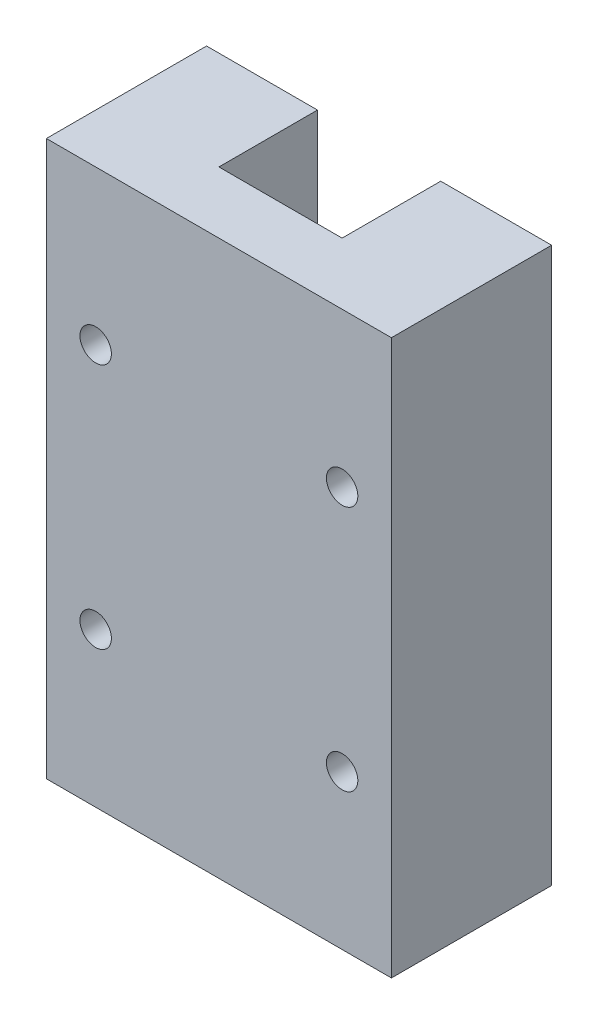
ISO-10303-21;
HEADER;
FILE_DESCRIPTION(('STEP AP214'),'2;1');
FILE_NAME('part.step','',(''),(''),'','','');
FILE_SCHEMA(('AUTOMOTIVE_DESIGN { 1 0 10303 214 1 1 1 1 }'));
ENDSEC;
DATA;
#1=APPLICATION_CONTEXT('core data for automotive mechanical design processes');
#2=APPLICATION_PROTOCOL_DEFINITION('international standard','automotive_design',2000,#1);
#3=PRODUCT_CONTEXT('',#1,'mechanical');
#4=PRODUCT('Part','Part','',(#3));
#5=PRODUCT_RELATED_PRODUCT_CATEGORY('part','',(#4));
#6=PRODUCT_DEFINITION_FORMATION('','',#4);
#7=PRODUCT_DEFINITION_CONTEXT('part definition',#1,'design');
#8=PRODUCT_DEFINITION('design','',#6,#7);
#9=PRODUCT_DEFINITION_SHAPE('','',#8);
#10=(LENGTH_UNIT() NAMED_UNIT(*) SI_UNIT(.MILLI.,.METRE.));
#11=(NAMED_UNIT(*) PLANE_ANGLE_UNIT() SI_UNIT($,.RADIAN.));
#12=(NAMED_UNIT(*) SI_UNIT($,.STERADIAN.) SOLID_ANGLE_UNIT());
#13=UNCERTAINTY_MEASURE_WITH_UNIT(LENGTH_MEASURE(1.E-05),#10,'distance_accuracy_value','');
#14=(GEOMETRIC_REPRESENTATION_CONTEXT(3) GLOBAL_UNCERTAINTY_ASSIGNED_CONTEXT((#13)) GLOBAL_UNIT_ASSIGNED_CONTEXT((#10,
#11,#12)) REPRESENTATION_CONTEXT('',''));
#15=CARTESIAN_POINT('',(0.,0.,0.));
#16=DIRECTION('',(0.,0.,1.));
#17=DIRECTION('',(1.,0.,0.));
#18=AXIS2_PLACEMENT_3D('',#15,#16,#17);
#19=CARTESIAN_POINT('',(0.,45.,-13.));
#20=DIRECTION('',(0.,0.,-1.));
#21=DIRECTION('',(-1.,0.,0.));
#22=AXIS2_PLACEMENT_3D('',#19,#20,#21);
#23=PLANE('',#22);
#24=CARTESIAN_POINT('',(10.,12.5,-13.));
#25=DIRECTION('',(0.,0.,-1.));
#26=DIRECTION('',(-1.,0.,0.));
#27=AXIS2_PLACEMENT_3D('',#24,#25,#26);
#28=CIRCLE('',#27,1.27410282823625);
#29=CARTESIAN_POINT('',(8.72589717176375,12.5,-13.));
#30=VERTEX_POINT('',#29);
#31=EDGE_CURVE('E185',#30,#30,#28,.F.);
#32=ORIENTED_EDGE('',*,*,#31,.T.);
#33=EDGE_LOOP('',(#32));
#34=FACE_BOUND('',#33,.T.);
#35=CARTESIAN_POINT('',(10.,32.5,-13.));
#36=DIRECTION('',(0.,0.,-1.));
#37=DIRECTION('',(-1.,0.,0.));
#38=AXIS2_PLACEMENT_3D('',#35,#36,#37);
#39=CIRCLE('',#38,1.27410282823625);
#40=CARTESIAN_POINT('',(8.72589717176375,32.5,-13.));
#41=VERTEX_POINT('',#40);
#42=EDGE_CURVE('E179',#41,#41,#39,.F.);
#43=ORIENTED_EDGE('',*,*,#42,.T.);
#44=EDGE_LOOP('',(#43));
#45=FACE_BOUND('',#44,.T.);
#46=DIRECTION('',(1.,0.,0.));
#47=VECTOR('',#46,1.);
#48=CARTESIAN_POINT('',(0.,0.,-13.));
#49=LINE('',#48,#47);
#50=CARTESIAN_POINT('',(5.00000000000001,0.,-13.));
#51=VERTEX_POINT('',#50);
#52=CARTESIAN_POINT('',(14.,0.,-13.));
#53=VERTEX_POINT('',#52);
#54=EDGE_CURVE('E130',#51,#53,#49,.T.);
#55=ORIENTED_EDGE('',*,*,#54,.F.);
#56=DIRECTION('',(0.,-1.,0.));
#57=VECTOR('',#56,1.);
#58=CARTESIAN_POINT('',(5.00000000000001,45.,-13.));
#59=LINE('',#58,#57);
#60=CARTESIAN_POINT('',(5.00000000000001,45.,-13.));
#61=VERTEX_POINT('',#60);
#62=EDGE_CURVE('E11',#61,#51,#59,.T.);
#63=ORIENTED_EDGE('',*,*,#62,.F.);
#64=DIRECTION('',(1.,0.,0.));
#65=VECTOR('',#64,1.);
#66=CARTESIAN_POINT('',(0.,45.,-13.));
#67=LINE('',#66,#65);
#68=CARTESIAN_POINT('',(14.,45.,-13.));
#69=VERTEX_POINT('',#68);
#70=EDGE_CURVE('E149',#61,#69,#67,.T.);
#71=ORIENTED_EDGE('',*,*,#70,.T.);
#72=DIRECTION('',(0.,-1.,0.));
#73=VECTOR('',#72,1.);
#74=CARTESIAN_POINT('',(14.,45.,-13.));
#75=LINE('',#74,#73);
#76=EDGE_CURVE('E52',#69,#53,#75,.T.);
#77=ORIENTED_EDGE('',*,*,#76,.T.);
#78=EDGE_LOOP('',(#55,#63,#71,#77));
#79=FACE_BOUND('',#78,.T.);
#80=ADVANCED_FACE('F35',(#34,#45,#79),#23,.T.);
#81=CARTESIAN_POINT('',(5.00000000000001,45.,0.));
#82=DIRECTION('',(1.,0.,0.));
#83=DIRECTION('',(0.,0.,-1.));
#84=AXIS2_PLACEMENT_3D('',#81,#82,#83);
#85=PLANE('',#84);
#86=DIRECTION('',(0.,0.,1.));
#87=VECTOR('',#86,1.);
#88=CARTESIAN_POINT('',(5.00000000000001,0.,0.));
#89=LINE('',#88,#87);
#90=CARTESIAN_POINT('',(5.00000000000001,0.,-5.));
#91=VERTEX_POINT('',#90);
#92=EDGE_CURVE('E132',#51,#91,#89,.T.);
#93=ORIENTED_EDGE('',*,*,#92,.T.);
#94=DIRECTION('',(0.,-1.,0.));
#95=VECTOR('',#94,1.);
#96=CARTESIAN_POINT('',(5.00000000000001,45.,-5.));
#97=LINE('',#96,#95);
#98=CARTESIAN_POINT('',(5.00000000000001,45.,-5.));
#99=VERTEX_POINT('',#98);
#100=EDGE_CURVE('E44',#99,#91,#97,.T.);
#101=ORIENTED_EDGE('',*,*,#100,.F.);
#102=DIRECTION('',(0.,0.,1.));
#103=VECTOR('',#102,1.);
#104=CARTESIAN_POINT('',(5.00000000000001,45.,0.));
#105=LINE('',#104,#103);
#106=EDGE_CURVE('E174',#61,#99,#105,.T.);
#107=ORIENTED_EDGE('',*,*,#106,.F.);
#108=ORIENTED_EDGE('',*,*,#62,.T.);
#109=EDGE_LOOP('',(#93,#101,#107,#108));
#110=FACE_BOUND('',#109,.T.);
#111=ADVANCED_FACE('F37',(#110),#85,.F.);
#112=CARTESIAN_POINT('',(0.,45.,-5.));
#113=DIRECTION('',(0.,0.,-1.));
#114=DIRECTION('',(-1.,0.,0.));
#115=AXIS2_PLACEMENT_3D('',#112,#113,#114);
#116=PLANE('',#115);
#117=DIRECTION('',(1.,0.,0.));
#118=VECTOR('',#117,1.);
#119=CARTESIAN_POINT('',(0.,0.,-5.));
#120=LINE('',#119,#118);
#121=CARTESIAN_POINT('',(-4.99999999999999,0.,-5.));
#122=VERTEX_POINT('',#121);
#123=EDGE_CURVE('E137',#122,#91,#120,.T.);
#124=ORIENTED_EDGE('',*,*,#123,.F.);
#125=DIRECTION('',(0.,-1.,0.));
#126=VECTOR('',#125,1.);
#127=CARTESIAN_POINT('',(-4.99999999999999,45.,-5.));
#128=LINE('',#127,#126);
#129=CARTESIAN_POINT('',(-4.99999999999999,45.,-5.));
#130=VERTEX_POINT('',#129);
#131=EDGE_CURVE('E155',#130,#122,#128,.T.);
#132=ORIENTED_EDGE('',*,*,#131,.F.);
#133=DIRECTION('',(1.,0.,0.));
#134=VECTOR('',#133,1.);
#135=CARTESIAN_POINT('',(0.,45.,-5.));
#136=LINE('',#135,#134);
#137=EDGE_CURVE('E162',#130,#99,#136,.T.);
#138=ORIENTED_EDGE('',*,*,#137,.T.);
#139=ORIENTED_EDGE('',*,*,#100,.T.);
#140=EDGE_LOOP('',(#124,#132,#138,#139));
#141=FACE_BOUND('',#140,.T.);
#142=ADVANCED_FACE('F160',(#141),#116,.T.);
#143=CARTESIAN_POINT('',(-4.99999999999999,45.,0.));
#144=DIRECTION('',(1.,0.,0.));
#145=DIRECTION('',(0.,0.,-1.));
#146=AXIS2_PLACEMENT_3D('',#143,#144,#145);
#147=PLANE('',#146);
#148=DIRECTION('',(0.,0.,1.));
#149=VECTOR('',#148,1.);
#150=CARTESIAN_POINT('',(-4.99999999999999,0.,0.));
#151=LINE('',#150,#149);
#152=CARTESIAN_POINT('',(-4.99999999999999,0.,-13.));
#153=VERTEX_POINT('',#152);
#154=EDGE_CURVE('E140',#153,#122,#151,.T.);
#155=ORIENTED_EDGE('',*,*,#154,.F.);
#156=DIRECTION('',(0.,-1.,0.));
#157=VECTOR('',#156,1.);
#158=CARTESIAN_POINT('',(-4.99999999999999,45.,-13.));
#159=LINE('',#158,#157);
#160=CARTESIAN_POINT('',(-4.99999999999999,45.,-13.));
#161=VERTEX_POINT('',#160);
#162=EDGE_CURVE('E153',#161,#153,#159,.T.);
#163=ORIENTED_EDGE('',*,*,#162,.F.);
#164=DIRECTION('',(0.,0.,1.));
#165=VECTOR('',#164,1.);
#166=CARTESIAN_POINT('',(-4.99999999999999,45.,0.));
#167=LINE('',#166,#165);
#168=EDGE_CURVE('E173',#161,#130,#167,.T.);
#169=ORIENTED_EDGE('',*,*,#168,.T.);
#170=ORIENTED_EDGE('',*,*,#131,.T.);
#171=EDGE_LOOP('',(#155,#163,#169,#170));
#172=FACE_BOUND('',#171,.T.);
#173=ADVANCED_FACE('F171',(#172),#147,.T.);
#174=CARTESIAN_POINT('',(-10.,32.5,-13.));
#175=DIRECTION('',(0.,0.,-1.));
#176=DIRECTION('',(-1.,0.,0.));
#177=AXIS2_PLACEMENT_3D('',#174,#175,#176);
#178=CIRCLE('',#177,1.27410282823625);
#179=CARTESIAN_POINT('',(-11.2741028282363,32.5,-13.));
#180=VERTEX_POINT('',#179);
#181=EDGE_CURVE('E192',#180,#180,#178,.F.);
#182=ORIENTED_EDGE('',*,*,#181,.T.);
#183=EDGE_LOOP('',(#182));
#184=FACE_BOUND('',#183,.T.);
#185=CARTESIAN_POINT('',(-10.,12.5,-13.));
#186=DIRECTION('',(0.,0.,-1.));
#187=DIRECTION('',(-1.,0.,0.));
#188=AXIS2_PLACEMENT_3D('',#185,#186,#187);
#189=CIRCLE('',#188,1.27410282823625);
#190=CARTESIAN_POINT('',(-11.2741028282363,12.5,-13.));
#191=VERTEX_POINT('',#190);
#192=EDGE_CURVE('E197',#191,#191,#189,.F.);
#193=ORIENTED_EDGE('',*,*,#192,.T.);
#194=EDGE_LOOP('',(#193));
#195=FACE_BOUND('',#194,.T.);
#196=CARTESIAN_POINT('',(-14.,0.,-13.));
#197=VERTEX_POINT('',#196);
#198=EDGE_CURVE('E134',#197,#153,#49,.T.);
#199=ORIENTED_EDGE('',*,*,#198,.F.);
#200=DIRECTION('',(0.,-1.,0.));
#201=VECTOR('',#200,1.);
#202=CARTESIAN_POINT('',(-14.,45.,-13.));
#203=LINE('',#202,#201);
#204=CARTESIAN_POINT('',(-14.,45.,-13.));
#205=VERTEX_POINT('',#204);
#206=EDGE_CURVE('E122',#205,#197,#203,.T.);
#207=ORIENTED_EDGE('',*,*,#206,.F.);
#208=EDGE_CURVE('E112',#205,#161,#67,.T.);
#209=ORIENTED_EDGE('',*,*,#208,.T.);
#210=ORIENTED_EDGE('',*,*,#162,.T.);
#211=EDGE_LOOP('',(#199,#207,#209,#210));
#212=FACE_BOUND('',#211,.T.);
#213=ADVANCED_FACE('F230',(#184,#195,#212),#23,.T.);
#214=CARTESIAN_POINT('',(-14.,45.,0.));
#215=DIRECTION('',(1.,0.,0.));
#216=DIRECTION('',(0.,0.,-1.));
#217=AXIS2_PLACEMENT_3D('',#214,#215,#216);
#218=PLANE('',#217);
#219=DIRECTION('',(0.,0.,1.));
#220=VECTOR('',#219,1.);
#221=CARTESIAN_POINT('',(-14.,0.,0.));
#222=LINE('',#221,#220);
#223=CARTESIAN_POINT('',(-14.,0.,0.));
#224=VERTEX_POINT('',#223);
#225=EDGE_CURVE('E119',#197,#224,#222,.T.);
#226=ORIENTED_EDGE('',*,*,#225,.T.);
#227=DIRECTION('',(0.,-1.,0.));
#228=VECTOR('',#227,1.);
#229=CARTESIAN_POINT('',(-14.,45.,0.));
#230=LINE('',#229,#228);
#231=CARTESIAN_POINT('',(-14.,45.,0.));
#232=VERTEX_POINT('',#231);
#233=EDGE_CURVE('E116',#232,#224,#230,.T.);
#234=ORIENTED_EDGE('',*,*,#233,.F.);
#235=DIRECTION('',(0.,0.,1.));
#236=VECTOR('',#235,1.);
#237=CARTESIAN_POINT('',(-14.,45.,0.));
#238=LINE('',#237,#236);
#239=EDGE_CURVE('E103',#205,#232,#238,.T.);
#240=ORIENTED_EDGE('',*,*,#239,.F.);
#241=ORIENTED_EDGE('',*,*,#206,.T.);
#242=EDGE_LOOP('',(#226,#234,#240,#241));
#243=FACE_BOUND('',#242,.T.);
#244=ADVANCED_FACE('F117',(#243),#218,.F.);
#245=CARTESIAN_POINT('',(0.,45.,0.));
#246=DIRECTION('',(0.,0.,-1.));
#247=DIRECTION('',(-1.,0.,0.));
#248=AXIS2_PLACEMENT_3D('',#245,#246,#247);
#249=PLANE('',#248);
#250=CARTESIAN_POINT('',(-10.,32.5,0.));
#251=DIRECTION('',(0.,0.,1.));
#252=DIRECTION('',(1.,0.,0.));
#253=AXIS2_PLACEMENT_3D('',#250,#251,#252);
#254=CIRCLE('',#253,1.27410282823625);
#255=CARTESIAN_POINT('',(-8.72589717176375,32.5,0.));
#256=VERTEX_POINT('',#255);
#257=EDGE_CURVE('E182',#256,#256,#254,.T.);
#258=ORIENTED_EDGE('',*,*,#257,.F.);
#259=EDGE_LOOP('',(#258));
#260=FACE_BOUND('',#259,.T.);
#261=CARTESIAN_POINT('',(10.,12.5,0.));
#262=DIRECTION('',(0.,0.,1.));
#263=DIRECTION('',(1.,0.,0.));
#264=AXIS2_PLACEMENT_3D('',#261,#262,#263);
#265=CIRCLE('',#264,1.27410282823625);
#266=CARTESIAN_POINT('',(11.2741028282363,12.5,0.));
#267=VERTEX_POINT('',#266);
#268=EDGE_CURVE('E188',#267,#267,#265,.T.);
#269=ORIENTED_EDGE('',*,*,#268,.F.);
#270=EDGE_LOOP('',(#269));
#271=FACE_BOUND('',#270,.T.);
#272=CARTESIAN_POINT('',(-10.,12.5,0.));
#273=DIRECTION('',(0.,0.,1.));
#274=DIRECTION('',(1.,0.,0.));
#275=AXIS2_PLACEMENT_3D('',#272,#273,#274);
#276=CIRCLE('',#275,1.27410282823625);
#277=CARTESIAN_POINT('',(-8.72589717176375,12.5,0.));
#278=VERTEX_POINT('',#277);
#279=EDGE_CURVE('E189',#278,#278,#276,.T.);
#280=ORIENTED_EDGE('',*,*,#279,.F.);
#281=EDGE_LOOP('',(#280));
#282=FACE_BOUND('',#281,.T.);
#283=CARTESIAN_POINT('',(10.,32.5,0.));
#284=DIRECTION('',(0.,0.,1.));
#285=DIRECTION('',(1.,0.,0.));
#286=AXIS2_PLACEMENT_3D('',#283,#284,#285);
#287=CIRCLE('',#286,1.27410282823625);
#288=CARTESIAN_POINT('',(11.2741028282363,32.5,0.));
#289=VERTEX_POINT('',#288);
#290=EDGE_CURVE('E133',#289,#289,#287,.T.);
#291=ORIENTED_EDGE('',*,*,#290,.F.);
#292=EDGE_LOOP('',(#291));
#293=FACE_BOUND('',#292,.T.);
#294=DIRECTION('',(1.,0.,0.));
#295=VECTOR('',#294,1.);
#296=CARTESIAN_POINT('',(0.,0.,0.));
#297=LINE('',#296,#295);
#298=CARTESIAN_POINT('',(14.,0.,0.));
#299=VERTEX_POINT('',#298);
#300=EDGE_CURVE('E144',#224,#299,#297,.T.);
#301=ORIENTED_EDGE('',*,*,#300,.T.);
#302=DIRECTION('',(0.,-1.,0.));
#303=VECTOR('',#302,1.);
#304=CARTESIAN_POINT('',(14.,45.,0.));
#305=LINE('',#304,#303);
#306=CARTESIAN_POINT('',(14.,45.,0.));
#307=VERTEX_POINT('',#306);
#308=EDGE_CURVE('E78',#307,#299,#305,.T.);
#309=ORIENTED_EDGE('',*,*,#308,.F.);
#310=DIRECTION('',(1.,0.,0.));
#311=VECTOR('',#310,1.);
#312=CARTESIAN_POINT('',(0.,45.,0.));
#313=LINE('',#312,#311);
#314=EDGE_CURVE('E109',#232,#307,#313,.T.);
#315=ORIENTED_EDGE('',*,*,#314,.F.);
#316=ORIENTED_EDGE('',*,*,#233,.T.);
#317=EDGE_LOOP('',(#301,#309,#315,#316));
#318=FACE_BOUND('',#317,.T.);
#319=ADVANCED_FACE('F124',(#260,#271,#282,#293,#318),#249,.F.);
#320=CARTESIAN_POINT('',(14.,45.,0.));
#321=DIRECTION('',(1.,0.,0.));
#322=DIRECTION('',(0.,0.,-1.));
#323=AXIS2_PLACEMENT_3D('',#320,#321,#322);
#324=PLANE('',#323);
#325=DIRECTION('',(0.,0.,1.));
#326=VECTOR('',#325,1.);
#327=CARTESIAN_POINT('',(14.,0.,0.));
#328=LINE('',#327,#326);
#329=EDGE_CURVE('E146',#53,#299,#328,.T.);
#330=ORIENTED_EDGE('',*,*,#329,.F.);
#331=ORIENTED_EDGE('',*,*,#76,.F.);
#332=DIRECTION('',(0.,0.,1.));
#333=VECTOR('',#332,1.);
#334=CARTESIAN_POINT('',(14.,45.,0.));
#335=LINE('',#334,#333);
#336=EDGE_CURVE('E125',#69,#307,#335,.T.);
#337=ORIENTED_EDGE('',*,*,#336,.T.);
#338=ORIENTED_EDGE('',*,*,#308,.T.);
#339=EDGE_LOOP('',(#330,#331,#337,#338));
#340=FACE_BOUND('',#339,.T.);
#341=ADVANCED_FACE('F207',(#340),#324,.T.);
#342=CARTESIAN_POINT('',(0.,45.,0.));
#343=DIRECTION('',(0.,1.,0.));
#344=DIRECTION('',(0.,0.,1.));
#345=AXIS2_PLACEMENT_3D('',#342,#343,#344);
#346=PLANE('',#345);
#347=ORIENTED_EDGE('',*,*,#70,.F.);
#348=ORIENTED_EDGE('',*,*,#106,.T.);
#349=ORIENTED_EDGE('',*,*,#137,.F.);
#350=ORIENTED_EDGE('',*,*,#168,.F.);
#351=ORIENTED_EDGE('',*,*,#208,.F.);
#352=ORIENTED_EDGE('',*,*,#239,.T.);
#353=ORIENTED_EDGE('',*,*,#314,.T.);
#354=ORIENTED_EDGE('',*,*,#336,.F.);
#355=EDGE_LOOP('',(#347,#348,#349,#350,#351,#352,#353,#354));
#356=FACE_BOUND('',#355,.T.);
#357=ADVANCED_FACE('F106',(#356),#346,.T.);
#358=CARTESIAN_POINT('',(0.,0.,0.));
#359=DIRECTION('',(0.,1.,0.));
#360=DIRECTION('',(0.,0.,1.));
#361=AXIS2_PLACEMENT_3D('',#358,#359,#360);
#362=PLANE('',#361);
#363=ORIENTED_EDGE('',*,*,#54,.T.);
#364=ORIENTED_EDGE('',*,*,#329,.T.);
#365=ORIENTED_EDGE('',*,*,#300,.F.);
#366=ORIENTED_EDGE('',*,*,#225,.F.);
#367=ORIENTED_EDGE('',*,*,#198,.T.);
#368=ORIENTED_EDGE('',*,*,#154,.T.);
#369=ORIENTED_EDGE('',*,*,#123,.T.);
#370=ORIENTED_EDGE('',*,*,#92,.F.);
#371=EDGE_LOOP('',(#363,#364,#365,#366,#367,#368,#369,#370));
#372=FACE_BOUND('',#371,.T.);
#373=ADVANCED_FACE('F166',(#372),#362,.F.);
#374=CARTESIAN_POINT('',(10.,32.5,-13.001));
#375=DIRECTION('',(0.,0.,1.));
#376=DIRECTION('',(1.,0.,0.));
#377=AXIS2_PLACEMENT_3D('',#374,#375,#376);
#378=CYLINDRICAL_SURFACE('',#377,1.27410282823625);
#379=ORIENTED_EDGE('',*,*,#42,.F.);
#380=EDGE_LOOP('',(#379));
#381=FACE_BOUND('',#380,.T.);
#382=ORIENTED_EDGE('',*,*,#290,.T.);
#383=EDGE_LOOP('',(#382));
#384=FACE_BOUND('',#383,.T.);
#385=ADVANCED_FACE('F212',(#381,#384),#378,.F.);
#386=CARTESIAN_POINT('',(-10.,12.5,-13.001));
#387=DIRECTION('',(0.,0.,1.));
#388=DIRECTION('',(1.,0.,0.));
#389=AXIS2_PLACEMENT_3D('',#386,#387,#388);
#390=CYLINDRICAL_SURFACE('',#389,1.27410282823625);
#391=ORIENTED_EDGE('',*,*,#192,.F.);
#392=EDGE_LOOP('',(#391));
#393=FACE_BOUND('',#392,.T.);
#394=ORIENTED_EDGE('',*,*,#279,.T.);
#395=EDGE_LOOP('',(#394));
#396=FACE_BOUND('',#395,.T.);
#397=ADVANCED_FACE('F203',(#393,#396),#390,.F.);
#398=CARTESIAN_POINT('',(10.,12.5,-13.001));
#399=DIRECTION('',(0.,0.,1.));
#400=DIRECTION('',(1.,0.,0.));
#401=AXIS2_PLACEMENT_3D('',#398,#399,#400);
#402=CYLINDRICAL_SURFACE('',#401,1.27410282823625);
#403=ORIENTED_EDGE('',*,*,#31,.F.);
#404=EDGE_LOOP('',(#403));
#405=FACE_BOUND('',#404,.T.);
#406=ORIENTED_EDGE('',*,*,#268,.T.);
#407=EDGE_LOOP('',(#406));
#408=FACE_BOUND('',#407,.T.);
#409=ADVANCED_FACE('F220',(#405,#408),#402,.F.);
#410=CARTESIAN_POINT('',(-10.,32.5,-13.001));
#411=DIRECTION('',(0.,0.,1.));
#412=DIRECTION('',(1.,0.,0.));
#413=AXIS2_PLACEMENT_3D('',#410,#411,#412);
#414=CYLINDRICAL_SURFACE('',#413,1.27410282823625);
#415=ORIENTED_EDGE('',*,*,#181,.F.);
#416=EDGE_LOOP('',(#415));
#417=FACE_BOUND('',#416,.T.);
#418=ORIENTED_EDGE('',*,*,#257,.T.);
#419=EDGE_LOOP('',(#418));
#420=FACE_BOUND('',#419,.T.);
#421=ADVANCED_FACE('F295',(#417,#420),#414,.F.);
#422=CLOSED_SHELL('',(#80,#111,#142,#173,#213,#244,#319,#341,#357,#373,#385,#397,#409,#421));
#423=MANIFOLD_SOLID_BREP('B2',#422);
#424=ADVANCED_BREP_SHAPE_REPRESENTATION('',(#18,#423),#14);
#425=SHAPE_DEFINITION_REPRESENTATION(#9,#424);
ENDSEC;
END-ISO-10303-21;
